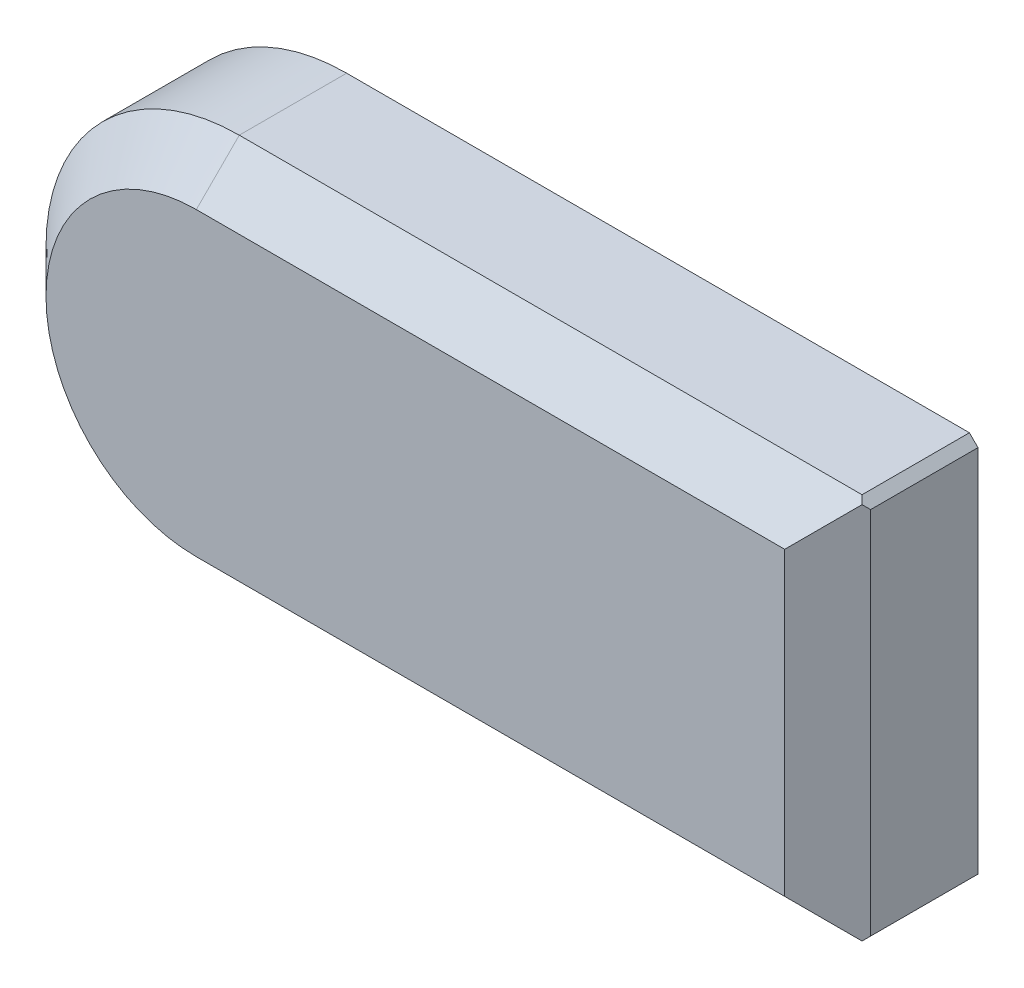
ISO-10303-21;
HEADER;
FILE_DESCRIPTION(('STEP AP214'),'2;1');
FILE_NAME('part.step','',(''),(''),'','','');
FILE_SCHEMA(('AUTOMOTIVE_DESIGN { 1 0 10303 214 1 1 1 1 }'));
ENDSEC;
DATA;
#1=APPLICATION_CONTEXT('core data for automotive mechanical design processes');
#2=APPLICATION_PROTOCOL_DEFINITION('international standard','automotive_design',2000,#1);
#3=PRODUCT_CONTEXT('',#1,'mechanical');
#4=PRODUCT('Part','Part','',(#3));
#5=PRODUCT_RELATED_PRODUCT_CATEGORY('part','',(#4));
#6=PRODUCT_DEFINITION_FORMATION('','',#4);
#7=PRODUCT_DEFINITION_CONTEXT('part definition',#1,'design');
#8=PRODUCT_DEFINITION('design','',#6,#7);
#9=PRODUCT_DEFINITION_SHAPE('','',#8);
#10=(LENGTH_UNIT() NAMED_UNIT(*) SI_UNIT(.MILLI.,.METRE.));
#11=(NAMED_UNIT(*) PLANE_ANGLE_UNIT() SI_UNIT($,.RADIAN.));
#12=(NAMED_UNIT(*) SI_UNIT($,.STERADIAN.) SOLID_ANGLE_UNIT());
#13=UNCERTAINTY_MEASURE_WITH_UNIT(LENGTH_MEASURE(1.E-05),#10,'distance_accuracy_value','');
#14=(GEOMETRIC_REPRESENTATION_CONTEXT(3) GLOBAL_UNCERTAINTY_ASSIGNED_CONTEXT((#13)) GLOBAL_UNIT_ASSIGNED_CONTEXT((#10,
#11,#12)) REPRESENTATION_CONTEXT('',''));
#15=CARTESIAN_POINT('',(0.,0.,0.));
#16=DIRECTION('',(0.,0.,1.));
#17=DIRECTION('',(1.,0.,0.));
#18=AXIS2_PLACEMENT_3D('',#15,#16,#17);
#19=CARTESIAN_POINT('',(-36.75,0.,17.5));
#20=DIRECTION('',(0.,0.,-1.));
#21=DIRECTION('',(-1.,0.,0.));
#22=AXIS2_PLACEMENT_3D('',#19,#20,#21);
#23=CYLINDRICAL_SURFACE('',#22,22.5);
#24=DIRECTION('',(0.,0.,-1.));
#25=VECTOR('',#24,1.);
#26=CARTESIAN_POINT('',(-36.75,-22.5,17.5));
#27=LINE('',#26,#25);
#28=CARTESIAN_POINT('',(-36.75,-22.5,12.5));
#29=VERTEX_POINT('',#28);
#30=CARTESIAN_POINT('',(-36.75,-22.5,0.));
#31=VERTEX_POINT('',#30);
#32=EDGE_CURVE('E371',#29,#31,#27,.T.);
#33=ORIENTED_EDGE('',*,*,#32,.F.);
#34=CARTESIAN_POINT('',(-36.75,0.,12.5));
#35=DIRECTION('',(0.,0.,1.));
#36=DIRECTION('',(1.,0.,0.));
#37=AXIS2_PLACEMENT_3D('',#34,#35,#36);
#38=CIRCLE('',#37,22.5);
#39=CARTESIAN_POINT('',(-36.75,22.5,12.5));
#40=VERTEX_POINT('',#39);
#41=EDGE_CURVE('E385',#29,#40,#38,.F.);
#42=ORIENTED_EDGE('',*,*,#41,.T.);
#43=DIRECTION('',(0.,0.,-1.));
#44=VECTOR('',#43,1.);
#45=CARTESIAN_POINT('',(-36.75,22.5,17.5));
#46=LINE('',#45,#44);
#47=CARTESIAN_POINT('',(-36.75,22.5,0.));
#48=VERTEX_POINT('',#47);
#49=EDGE_CURVE('E369',#40,#48,#46,.T.);
#50=ORIENTED_EDGE('',*,*,#49,.T.);
#51=CARTESIAN_POINT('',(-36.75,0.,0.));
#52=DIRECTION('',(0.,0.,1.));
#53=DIRECTION('',(1.,0.,0.));
#54=AXIS2_PLACEMENT_3D('',#51,#52,#53);
#55=CIRCLE('',#54,22.5);
#56=EDGE_CURVE('E357',#48,#31,#55,.T.);
#57=ORIENTED_EDGE('',*,*,#56,.T.);
#58=EDGE_LOOP('',(#33,#42,#50,#57));
#59=FACE_BOUND('',#58,.T.);
#60=ADVANCED_FACE('F41',(#59),#23,.T.);
#61=CARTESIAN_POINT('',(0.,-22.5,17.5));
#62=DIRECTION('',(0.,1.,0.));
#63=DIRECTION('',(0.,0.,1.));
#64=AXIS2_PLACEMENT_3D('',#61,#62,#63);
#65=PLANE('',#64);
#66=DIRECTION('',(1.,0.,0.));
#67=VECTOR('',#66,1.);
#68=CARTESIAN_POINT('',(0.,-22.5,0.));
#69=LINE('',#68,#67);
#70=CARTESIAN_POINT('',(35.75,-22.5,0.));
#71=VERTEX_POINT('',#70);
#72=EDGE_CURVE('E360',#31,#71,#69,.T.);
#73=ORIENTED_EDGE('',*,*,#72,.T.);
#74=DIRECTION('',(0.,0.,1.));
#75=VECTOR('',#74,1.);
#76=CARTESIAN_POINT('',(35.75,-22.5,12.5));
#77=LINE('',#76,#75);
#78=CARTESIAN_POINT('',(35.75,-22.5,12.5));
#79=VERTEX_POINT('',#78);
#80=EDGE_CURVE('E50',#71,#79,#77,.T.);
#81=ORIENTED_EDGE('',*,*,#80,.T.);
#82=DIRECTION('',(-1.,0.,0.));
#83=VECTOR('',#82,1.);
#84=CARTESIAN_POINT('',(-36.75,-22.5,12.5));
#85=LINE('',#84,#83);
#86=EDGE_CURVE('E383',#79,#29,#85,.T.);
#87=ORIENTED_EDGE('',*,*,#86,.T.);
#88=ORIENTED_EDGE('',*,*,#32,.T.);
#89=EDGE_LOOP('',(#73,#81,#87,#88));
#90=FACE_BOUND('',#89,.T.);
#91=ADVANCED_FACE('F448',(#90),#65,.F.);
#92=CARTESIAN_POINT('',(36.75,0.,17.5));
#93=DIRECTION('',(1.,0.,0.));
#94=DIRECTION('',(0.,1.,0.));
#95=AXIS2_PLACEMENT_3D('',#92,#93,#94);
#96=PLANE('',#95);
#97=DIRECTION('',(0.,-1.,0.));
#98=VECTOR('',#97,1.);
#99=CARTESIAN_POINT('',(36.75,0.,0.));
#100=LINE('',#99,#98);
#101=CARTESIAN_POINT('',(36.75,21.5,0.));
#102=VERTEX_POINT('',#101);
#103=CARTESIAN_POINT('',(36.75,-21.5,0.));
#104=VERTEX_POINT('',#103);
#105=EDGE_CURVE('E363',#102,#104,#100,.T.);
#106=ORIENTED_EDGE('',*,*,#105,.F.);
#107=DIRECTION('',(0.,0.,1.));
#108=VECTOR('',#107,1.);
#109=CARTESIAN_POINT('',(36.75,21.5,17.5));
#110=LINE('',#109,#108);
#111=CARTESIAN_POINT('',(36.75,21.5,12.5));
#112=VERTEX_POINT('',#111);
#113=EDGE_CURVE('E414',#102,#112,#110,.T.);
#114=ORIENTED_EDGE('',*,*,#113,.T.);
#115=DIRECTION('',(0.,-1.,0.));
#116=VECTOR('',#115,1.);
#117=CARTESIAN_POINT('',(36.75,0.,12.5));
#118=LINE('',#117,#116);
#119=CARTESIAN_POINT('',(36.75,-21.5,12.5));
#120=VERTEX_POINT('',#119);
#121=EDGE_CURVE('E387',#112,#120,#118,.T.);
#122=ORIENTED_EDGE('',*,*,#121,.T.);
#123=DIRECTION('',(0.,0.,-1.));
#124=VECTOR('',#123,1.);
#125=CARTESIAN_POINT('',(36.75,-21.5,0.));
#126=LINE('',#125,#124);
#127=EDGE_CURVE('E411',#120,#104,#126,.T.);
#128=ORIENTED_EDGE('',*,*,#127,.T.);
#129=EDGE_LOOP('',(#106,#114,#122,#128));
#130=FACE_BOUND('',#129,.T.);
#131=ADVANCED_FACE('F442',(#130),#96,.T.);
#132=CARTESIAN_POINT('',(0.,22.5,17.5));
#133=DIRECTION('',(0.,1.,0.));
#134=DIRECTION('',(0.,0.,1.));
#135=AXIS2_PLACEMENT_3D('',#132,#133,#134);
#136=PLANE('',#135);
#137=DIRECTION('',(1.,0.,0.));
#138=VECTOR('',#137,1.);
#139=CARTESIAN_POINT('',(0.,22.5,12.5));
#140=LINE('',#139,#138);
#141=CARTESIAN_POINT('',(35.75,22.5,12.5));
#142=VERTEX_POINT('',#141);
#143=EDGE_CURVE('E390',#40,#142,#140,.T.);
#144=ORIENTED_EDGE('',*,*,#143,.T.);
#145=DIRECTION('',(0.,0.,-1.));
#146=VECTOR('',#145,1.);
#147=CARTESIAN_POINT('',(35.75,22.5,17.5));
#148=LINE('',#147,#146);
#149=CARTESIAN_POINT('',(35.75,22.5,0.));
#150=VERTEX_POINT('',#149);
#151=EDGE_CURVE('E404',#142,#150,#148,.T.);
#152=ORIENTED_EDGE('',*,*,#151,.T.);
#153=DIRECTION('',(1.,0.,0.));
#154=VECTOR('',#153,1.);
#155=CARTESIAN_POINT('',(0.,22.5,0.));
#156=LINE('',#155,#154);
#157=EDGE_CURVE('E366',#48,#150,#156,.T.);
#158=ORIENTED_EDGE('',*,*,#157,.F.);
#159=ORIENTED_EDGE('',*,*,#49,.F.);
#160=EDGE_LOOP('',(#144,#152,#158,#159));
#161=FACE_BOUND('',#160,.T.);
#162=ADVANCED_FACE('F433',(#161),#136,.T.);
#163=CARTESIAN_POINT('',(0.,0.,17.5));
#164=DIRECTION('',(0.,0.,1.));
#165=DIRECTION('',(1.,0.,0.));
#166=AXIS2_PLACEMENT_3D('',#163,#164,#165);
#167=PLANE('',#166);
#168=CARTESIAN_POINT('',(-36.75,0.,17.5));
#169=DIRECTION('',(0.,0.,1.));
#170=DIRECTION('',(1.,0.,0.));
#171=AXIS2_PLACEMENT_3D('',#168,#169,#170);
#172=CIRCLE('',#171,17.5);
#173=CARTESIAN_POINT('',(-36.75,17.5,17.5));
#174=VERTEX_POINT('',#173);
#175=CARTESIAN_POINT('',(-36.75,-17.5,17.5));
#176=VERTEX_POINT('',#175);
#177=EDGE_CURVE('E378',#174,#176,#172,.T.);
#178=ORIENTED_EDGE('',*,*,#177,.T.);
#179=DIRECTION('',(1.,0.,0.));
#180=VECTOR('',#179,1.);
#181=CARTESIAN_POINT('',(36.75,-17.5,17.5));
#182=LINE('',#181,#180);
#183=CARTESIAN_POINT('',(31.75,-17.5,17.5));
#184=VERTEX_POINT('',#183);
#185=EDGE_CURVE('E380',#176,#184,#182,.T.);
#186=ORIENTED_EDGE('',*,*,#185,.T.);
#187=DIRECTION('',(0.,1.,0.));
#188=VECTOR('',#187,1.);
#189=CARTESIAN_POINT('',(31.75,0.,17.5));
#190=LINE('',#189,#188);
#191=CARTESIAN_POINT('',(31.75,17.5,17.5));
#192=VERTEX_POINT('',#191);
#193=EDGE_CURVE('E375',#184,#192,#190,.T.);
#194=ORIENTED_EDGE('',*,*,#193,.T.);
#195=DIRECTION('',(-1.,0.,0.));
#196=VECTOR('',#195,1.);
#197=CARTESIAN_POINT('',(0.,17.5,17.5));
#198=LINE('',#197,#196);
#199=EDGE_CURVE('E373',#192,#174,#198,.T.);
#200=ORIENTED_EDGE('',*,*,#199,.T.);
#201=EDGE_LOOP('',(#178,#186,#194,#200));
#202=FACE_BOUND('',#201,.T.);
#203=ADVANCED_FACE('F458',(#202),#167,.T.);
#204=CARTESIAN_POINT('',(0.,0.,0.));
#205=DIRECTION('',(0.,0.,1.));
#206=DIRECTION('',(1.,0.,0.));
#207=AXIS2_PLACEMENT_3D('',#204,#205,#206);
#208=PLANE('',#207);
#209=DIRECTION('',(1.,0.,0.));
#210=VECTOR('',#209,1.);
#211=CARTESIAN_POINT('',(-36.75,21.2,0.));
#212=LINE('',#211,#210);
#213=CARTESIAN_POINT('',(-36.75,21.2,0.));
#214=VERTEX_POINT('',#213);
#215=CARTESIAN_POINT('',(35.45,21.2,0.));
#216=VERTEX_POINT('',#215);
#217=EDGE_CURVE('E300',#214,#216,#212,.T.);
#218=ORIENTED_EDGE('',*,*,#217,.F.);
#219=CARTESIAN_POINT('',(-36.75,0.,0.));
#220=DIRECTION('',(0.,0.,-1.));
#221=DIRECTION('',(-1.,0.,0.));
#222=AXIS2_PLACEMENT_3D('',#219,#220,#221);
#223=CIRCLE('',#222,21.2);
#224=CARTESIAN_POINT('',(-36.75,-21.2,0.));
#225=VERTEX_POINT('',#224);
#226=EDGE_CURVE('E284',#225,#214,#223,.T.);
#227=ORIENTED_EDGE('',*,*,#226,.F.);
#228=DIRECTION('',(-1.,0.,0.));
#229=VECTOR('',#228,1.);
#230=CARTESIAN_POINT('',(-36.75,-21.2,0.));
#231=LINE('',#230,#229);
#232=CARTESIAN_POINT('',(35.45,-21.2,0.));
#233=VERTEX_POINT('',#232);
#234=EDGE_CURVE('E289',#233,#225,#231,.T.);
#235=ORIENTED_EDGE('',*,*,#234,.F.);
#236=DIRECTION('',(0.,-1.,0.));
#237=VECTOR('',#236,1.);
#238=CARTESIAN_POINT('',(35.45,21.2,0.));
#239=LINE('',#238,#237);
#240=EDGE_CURVE('E303',#216,#233,#239,.T.);
#241=ORIENTED_EDGE('',*,*,#240,.F.);
#242=EDGE_LOOP('',(#218,#227,#235,#241));
#243=FACE_BOUND('',#242,.T.);
#244=ORIENTED_EDGE('',*,*,#157,.T.);
#245=DIRECTION('',(-0.70710678118654,0.707106781186555,0.));
#246=VECTOR('',#245,1.);
#247=CARTESIAN_POINT('',(35.75,22.5,0.));
#248=LINE('',#247,#246);
#249=EDGE_CURVE('E409',#150,#102,#248,.F.);
#250=ORIENTED_EDGE('',*,*,#249,.T.);
#251=ORIENTED_EDGE('',*,*,#105,.T.);
#252=DIRECTION('',(-0.707106781186548,-0.707106781186548,0.));
#253=VECTOR('',#252,1.);
#254=CARTESIAN_POINT('',(36.75,-21.5,0.));
#255=LINE('',#254,#253);
#256=EDGE_CURVE('E407',#104,#71,#255,.T.);
#257=ORIENTED_EDGE('',*,*,#256,.T.);
#258=ORIENTED_EDGE('',*,*,#72,.F.);
#259=ORIENTED_EDGE('',*,*,#56,.F.);
#260=EDGE_LOOP('',(#244,#250,#251,#257,#258,#259));
#261=FACE_BOUND('',#260,.T.);
#262=ADVANCED_FACE('F439',(#243,#261),#208,.F.);
#263=CARTESIAN_POINT('',(0.,22.5,12.5));
#264=DIRECTION('',(0.,-0.707106781186546,-0.707106781186548));
#265=DIRECTION('',(1.,0.,0.));
#266=AXIS2_PLACEMENT_3D('',#263,#264,#265);
#267=PLANE('',#266);
#268=DIRECTION('',(0.577350269189626,0.577350269189626,-0.577350269189625));
#269=VECTOR('',#268,1.);
#270=CARTESIAN_POINT('',(24.5,10.25,24.75));
#271=LINE('',#270,#269);
#272=CARTESIAN_POINT('',(36.25,22.,13.));
#273=VERTEX_POINT('',#272);
#274=EDGE_CURVE('E398',#273,#192,#271,.F.);
#275=ORIENTED_EDGE('',*,*,#274,.F.);
#276=DIRECTION('',(-0.577350269189618,0.57735026918963,-0.577350269189629));
#277=VECTOR('',#276,1.);
#278=CARTESIAN_POINT('',(23.8333333333336,34.4166666666666,0.583333333333434));
#279=LINE('',#278,#277);
#280=EDGE_CURVE('E420',#273,#142,#279,.T.);
#281=ORIENTED_EDGE('',*,*,#280,.T.);
#282=ORIENTED_EDGE('',*,*,#143,.F.);
#283=DIRECTION('',(0.,0.707106781186548,-0.707106781186546));
#284=VECTOR('',#283,1.);
#285=CARTESIAN_POINT('',(-36.75,17.5,17.5));
#286=LINE('',#285,#284);
#287=EDGE_CURVE('E361',#174,#40,#286,.T.);
#288=ORIENTED_EDGE('',*,*,#287,.F.);
#289=ORIENTED_EDGE('',*,*,#199,.F.);
#290=EDGE_LOOP('',(#275,#281,#282,#288,#289));
#291=FACE_BOUND('',#290,.T.);
#292=ADVANCED_FACE('F425',(#291),#267,.F.);
#293=CARTESIAN_POINT('',(-36.75,0.,17.5));
#294=DIRECTION('',(0.,0.,-1.));
#295=DIRECTION('',(-1.,0.,0.));
#296=AXIS2_PLACEMENT_3D('',#293,#294,#295);
#297=CONICAL_SURFACE('',#296,17.5,0.78539816339745);
#298=ORIENTED_EDGE('',*,*,#287,.T.);
#299=ORIENTED_EDGE('',*,*,#41,.F.);
#300=DIRECTION('',(0.,-0.707106781186548,-0.707106781186546));
#301=VECTOR('',#300,1.);
#302=CARTESIAN_POINT('',(-36.75,-17.5,17.5));
#303=LINE('',#302,#301);
#304=EDGE_CURVE('E395',#176,#29,#303,.T.);
#305=ORIENTED_EDGE('',*,*,#304,.F.);
#306=ORIENTED_EDGE('',*,*,#177,.F.);
#307=EDGE_LOOP('',(#298,#299,#305,#306));
#308=FACE_BOUND('',#307,.T.);
#309=ADVANCED_FACE('F454',(#308),#297,.T.);
#310=CARTESIAN_POINT('',(36.75,0.,12.5));
#311=DIRECTION('',(-0.707106781186546,0.,-0.707106781186548));
#312=DIRECTION('',(0.,-1.,0.));
#313=AXIS2_PLACEMENT_3D('',#310,#311,#312);
#314=PLANE('',#313);
#315=ORIENTED_EDGE('',*,*,#121,.F.);
#316=DIRECTION('',(-0.577350269189622,0.577350269189634,0.577350269189621));
#317=VECTOR('',#316,1.);
#318=CARTESIAN_POINT('',(43.9166666666667,14.3333333333331,5.33333333333331));
#319=LINE('',#318,#317);
#320=EDGE_CURVE('E418',#112,#273,#319,.T.);
#321=ORIENTED_EDGE('',*,*,#320,.T.);
#322=ORIENTED_EDGE('',*,*,#274,.T.);
#323=ORIENTED_EDGE('',*,*,#193,.F.);
#324=DIRECTION('',(-0.577350269189626,0.577350269189626,0.577350269189625));
#325=VECTOR('',#324,1.);
#326=CARTESIAN_POINT('',(29.25,-15.,20.));
#327=LINE('',#326,#325);
#328=CARTESIAN_POINT('',(36.25,-22.,13.));
#329=VERTEX_POINT('',#328);
#330=EDGE_CURVE('E341',#329,#184,#327,.T.);
#331=ORIENTED_EDGE('',*,*,#330,.F.);
#332=DIRECTION('',(-0.577350269189626,-0.577350269189626,0.577350269189625));
#333=VECTOR('',#332,1.);
#334=CARTESIAN_POINT('',(43.9166666666667,-14.3333333333333,5.33333333333336));
#335=LINE('',#334,#333);
#336=EDGE_CURVE('E416',#329,#120,#335,.F.);
#337=ORIENTED_EDGE('',*,*,#336,.T.);
#338=EDGE_LOOP('',(#315,#321,#322,#323,#331,#337));
#339=FACE_BOUND('',#338,.T.);
#340=ADVANCED_FACE('F461',(#339),#314,.F.);
#341=CARTESIAN_POINT('',(0.,-17.5,17.5));
#342=DIRECTION('',(0.,-0.707106781186546,0.707106781186548));
#343=DIRECTION('',(-1.,0.,0.));
#344=AXIS2_PLACEMENT_3D('',#341,#342,#343);
#345=PLANE('',#344);
#346=ORIENTED_EDGE('',*,*,#86,.F.);
#347=DIRECTION('',(0.577350269189626,0.577350269189626,0.577350269189625));
#348=VECTOR('',#347,1.);
#349=CARTESIAN_POINT('',(27.1666666666666,-31.0833333333333,3.91666666666668));
#350=LINE('',#349,#348);
#351=EDGE_CURVE('E12',#79,#329,#350,.T.);
#352=ORIENTED_EDGE('',*,*,#351,.T.);
#353=ORIENTED_EDGE('',*,*,#330,.T.);
#354=ORIENTED_EDGE('',*,*,#185,.F.);
#355=ORIENTED_EDGE('',*,*,#304,.T.);
#356=EDGE_LOOP('',(#346,#352,#353,#354,#355));
#357=FACE_BOUND('',#356,.T.);
#358=ADVANCED_FACE('F462',(#357),#345,.T.);
#359=CARTESIAN_POINT('',(-36.75,0.,1.2));
#360=DIRECTION('',(0.,0.,-1.));
#361=DIRECTION('',(-1.,0.,0.));
#362=AXIS2_PLACEMENT_3D('',#359,#360,#361);
#363=CYLINDRICAL_SURFACE('',#362,21.2);
#364=ORIENTED_EDGE('',*,*,#226,.T.);
#365=DIRECTION('',(0.,0.,-1.));
#366=VECTOR('',#365,1.);
#367=CARTESIAN_POINT('',(-36.75,21.2,1.2));
#368=LINE('',#367,#366);
#369=CARTESIAN_POINT('',(-36.75,21.2,1.2));
#370=VERTEX_POINT('',#369);
#371=EDGE_CURVE('E298',#370,#214,#368,.T.);
#372=ORIENTED_EDGE('',*,*,#371,.F.);
#373=CARTESIAN_POINT('',(-36.75,0.,1.2));
#374=DIRECTION('',(0.,0.,-1.));
#375=DIRECTION('',(-1.,0.,0.));
#376=AXIS2_PLACEMENT_3D('',#373,#374,#375);
#377=CIRCLE('',#376,21.2);
#378=CARTESIAN_POINT('',(-36.75,-21.2,1.2));
#379=VERTEX_POINT('',#378);
#380=EDGE_CURVE('E285',#379,#370,#377,.T.);
#381=ORIENTED_EDGE('',*,*,#380,.F.);
#382=DIRECTION('',(0.,0.,-1.));
#383=VECTOR('',#382,1.);
#384=CARTESIAN_POINT('',(-36.75,-21.2,1.2));
#385=LINE('',#384,#383);
#386=EDGE_CURVE('E308',#379,#225,#385,.T.);
#387=ORIENTED_EDGE('',*,*,#386,.T.);
#388=EDGE_LOOP('',(#364,#372,#381,#387));
#389=FACE_BOUND('',#388,.T.);
#390=ADVANCED_FACE('F464',(#389),#363,.F.);
#391=CARTESIAN_POINT('',(-36.75,-21.2,1.2));
#392=DIRECTION('',(0.,-1.,0.));
#393=DIRECTION('',(0.,0.,-1.));
#394=AXIS2_PLACEMENT_3D('',#391,#392,#393);
#395=PLANE('',#394);
#396=ORIENTED_EDGE('',*,*,#234,.T.);
#397=ORIENTED_EDGE('',*,*,#386,.F.);
#398=DIRECTION('',(-1.,0.,0.));
#399=VECTOR('',#398,1.);
#400=CARTESIAN_POINT('',(-36.75,-21.2,1.2));
#401=LINE('',#400,#399);
#402=CARTESIAN_POINT('',(35.45,-21.2,1.2));
#403=VERTEX_POINT('',#402);
#404=EDGE_CURVE('E295',#403,#379,#401,.T.);
#405=ORIENTED_EDGE('',*,*,#404,.F.);
#406=DIRECTION('',(0.,0.,-1.));
#407=VECTOR('',#406,1.);
#408=CARTESIAN_POINT('',(35.45,-21.2,1.2));
#409=LINE('',#408,#407);
#410=EDGE_CURVE('E311',#403,#233,#409,.T.);
#411=ORIENTED_EDGE('',*,*,#410,.T.);
#412=EDGE_LOOP('',(#396,#397,#405,#411));
#413=FACE_BOUND('',#412,.T.);
#414=ADVANCED_FACE('F470',(#413),#395,.F.);
#415=CARTESIAN_POINT('',(35.45,21.2,1.2));
#416=DIRECTION('',(1.,0.,0.));
#417=DIRECTION('',(0.,1.,0.));
#418=AXIS2_PLACEMENT_3D('',#415,#416,#417);
#419=PLANE('',#418);
#420=ORIENTED_EDGE('',*,*,#240,.T.);
#421=ORIENTED_EDGE('',*,*,#410,.F.);
#422=DIRECTION('',(0.,-1.,0.));
#423=VECTOR('',#422,1.);
#424=CARTESIAN_POINT('',(35.45,21.2,1.2));
#425=LINE('',#424,#423);
#426=CARTESIAN_POINT('',(35.45,21.2,1.2));
#427=VERTEX_POINT('',#426);
#428=EDGE_CURVE('E292',#427,#403,#425,.T.);
#429=ORIENTED_EDGE('',*,*,#428,.F.);
#430=DIRECTION('',(0.,0.,-1.));
#431=VECTOR('',#430,1.);
#432=CARTESIAN_POINT('',(35.45,21.2,1.2));
#433=LINE('',#432,#431);
#434=EDGE_CURVE('E313',#427,#216,#433,.T.);
#435=ORIENTED_EDGE('',*,*,#434,.T.);
#436=EDGE_LOOP('',(#420,#421,#429,#435));
#437=FACE_BOUND('',#436,.T.);
#438=ADVANCED_FACE('F532',(#437),#419,.F.);
#439=CARTESIAN_POINT('',(-36.75,21.2,1.2));
#440=DIRECTION('',(0.,1.,0.));
#441=DIRECTION('',(0.,0.,1.));
#442=AXIS2_PLACEMENT_3D('',#439,#440,#441);
#443=PLANE('',#442);
#444=ORIENTED_EDGE('',*,*,#217,.T.);
#445=ORIENTED_EDGE('',*,*,#434,.F.);
#446=DIRECTION('',(1.,0.,0.));
#447=VECTOR('',#446,1.);
#448=CARTESIAN_POINT('',(-36.75,21.2,1.2));
#449=LINE('',#448,#447);
#450=EDGE_CURVE('E288',#370,#427,#449,.T.);
#451=ORIENTED_EDGE('',*,*,#450,.F.);
#452=ORIENTED_EDGE('',*,*,#371,.T.);
#453=EDGE_LOOP('',(#444,#445,#451,#452));
#454=FACE_BOUND('',#453,.T.);
#455=ADVANCED_FACE('F529',(#454),#443,.F.);
#456=CARTESIAN_POINT('',(-36.75,0.,1.2));
#457=DIRECTION('',(0.,0.,-1.));
#458=DIRECTION('',(-1.,0.,0.));
#459=AXIS2_PLACEMENT_3D('',#456,#457,#458);
#460=PLANE('',#459);
#461=DIRECTION('',(-1.,0.,0.));
#462=VECTOR('',#461,1.);
#463=CARTESIAN_POINT('',(-36.75,-20.,1.2));
#464=LINE('',#463,#462);
#465=CARTESIAN_POINT('',(34.25,-20.,1.2));
#466=VERTEX_POINT('',#465);
#467=CARTESIAN_POINT('',(-36.75,-20.,1.2));
#468=VERTEX_POINT('',#467);
#469=EDGE_CURVE('E281',#466,#468,#464,.T.);
#470=ORIENTED_EDGE('',*,*,#469,.F.);
#471=DIRECTION('',(0.,-1.,0.));
#472=VECTOR('',#471,1.);
#473=CARTESIAN_POINT('',(34.25,20.,1.2));
#474=LINE('',#473,#472);
#475=CARTESIAN_POINT('',(34.25,20.,1.2));
#476=VERTEX_POINT('',#475);
#477=EDGE_CURVE('E278',#476,#466,#474,.T.);
#478=ORIENTED_EDGE('',*,*,#477,.F.);
#479=DIRECTION('',(1.,0.,0.));
#480=VECTOR('',#479,1.);
#481=CARTESIAN_POINT('',(-36.75,20.,1.2));
#482=LINE('',#481,#480);
#483=CARTESIAN_POINT('',(-36.75,20.,1.2));
#484=VERTEX_POINT('',#483);
#485=EDGE_CURVE('E275',#484,#476,#482,.T.);
#486=ORIENTED_EDGE('',*,*,#485,.F.);
#487=CARTESIAN_POINT('',(-36.75,0.,1.2));
#488=DIRECTION('',(0.,0.,-1.));
#489=DIRECTION('',(-1.,0.,0.));
#490=AXIS2_PLACEMENT_3D('',#487,#488,#489);
#491=CIRCLE('',#490,20.);
#492=EDGE_CURVE('E272',#468,#484,#491,.T.);
#493=ORIENTED_EDGE('',*,*,#492,.F.);
#494=EDGE_LOOP('',(#470,#478,#486,#493));
#495=FACE_BOUND('',#494,.T.);
#496=ORIENTED_EDGE('',*,*,#380,.T.);
#497=ORIENTED_EDGE('',*,*,#450,.T.);
#498=ORIENTED_EDGE('',*,*,#428,.T.);
#499=ORIENTED_EDGE('',*,*,#404,.T.);
#500=EDGE_LOOP('',(#496,#497,#498,#499));
#501=FACE_BOUND('',#500,.T.);
#502=ADVANCED_FACE('F511',(#495,#501),#460,.T.);
#503=CARTESIAN_POINT('',(0.,0.,15.));
#504=DIRECTION('',(0.,0.,1.));
#505=DIRECTION('',(1.,0.,0.));
#506=AXIS2_PLACEMENT_3D('',#503,#504,#505);
#507=PLANE('',#506);
#508=CARTESIAN_POINT('',(-11.25,0.,15.));
#509=DIRECTION('',(0.,0.,1.));
#510=DIRECTION('',(1.,0.,0.));
#511=AXIS2_PLACEMENT_3D('',#508,#509,#510);
#512=CIRCLE('',#511,5.);
#513=CARTESIAN_POINT('',(-6.25,0.,15.));
#514=VERTEX_POINT('',#513);
#515=EDGE_CURVE('E393',#514,#514,#512,.F.);
#516=ORIENTED_EDGE('',*,*,#515,.F.);
#517=EDGE_LOOP('',(#516));
#518=FACE_BOUND('',#517,.T.);
#519=CARTESIAN_POINT('',(-36.75,0.,15.));
#520=DIRECTION('',(0.,0.,1.));
#521=DIRECTION('',(1.,0.,0.));
#522=AXIS2_PLACEMENT_3D('',#519,#520,#521);
#523=CIRCLE('',#522,16.4644660940673);
#524=CARTESIAN_POINT('',(-36.75,16.4644660940673,15.));
#525=VERTEX_POINT('',#524);
#526=CARTESIAN_POINT('',(-36.75,-16.4644660940673,15.));
#527=VERTEX_POINT('',#526);
#528=EDGE_CURVE('E350',#525,#527,#523,.T.);
#529=ORIENTED_EDGE('',*,*,#528,.F.);
#530=DIRECTION('',(1.,0.,0.));
#531=VECTOR('',#530,1.);
#532=CARTESIAN_POINT('',(0.,16.4644660940673,15.));
#533=LINE('',#532,#531);
#534=CARTESIAN_POINT('',(30.7144660940673,16.4644660940673,15.));
#535=VERTEX_POINT('',#534);
#536=EDGE_CURVE('E320',#535,#525,#533,.F.);
#537=ORIENTED_EDGE('',*,*,#536,.F.);
#538=DIRECTION('',(0.,-1.,0.));
#539=VECTOR('',#538,1.);
#540=CARTESIAN_POINT('',(30.7144660940673,0.,15.));
#541=LINE('',#540,#539);
#542=CARTESIAN_POINT('',(30.7144660940673,-16.4644660940673,15.));
#543=VERTEX_POINT('',#542);
#544=EDGE_CURVE('E349',#543,#535,#541,.F.);
#545=ORIENTED_EDGE('',*,*,#544,.F.);
#546=DIRECTION('',(1.,0.,0.));
#547=VECTOR('',#546,1.);
#548=CARTESIAN_POINT('',(0.,-16.4644660940673,15.));
#549=LINE('',#548,#547);
#550=EDGE_CURVE('E335',#527,#543,#549,.T.);
#551=ORIENTED_EDGE('',*,*,#550,.F.);
#552=EDGE_LOOP('',(#529,#537,#545,#551));
#553=FACE_BOUND('',#552,.T.);
#554=ADVANCED_FACE('F503',(#518,#553),#507,.F.);
#555=CARTESIAN_POINT('',(-36.75,0.,15.7322330470336));
#556=DIRECTION('',(0.,0.,-1.));
#557=DIRECTION('',(-1.,0.,0.));
#558=AXIS2_PLACEMENT_3D('',#555,#556,#557);
#559=CONICAL_SURFACE('',#558,15.7322330470336,0.78539816339745);
#560=DIRECTION('',(0.,0.707106781186548,-0.707106781186547));
#561=VECTOR('',#560,1.);
#562=CARTESIAN_POINT('',(-36.75,15.7322330470336,15.7322330470336));
#563=LINE('',#562,#561);
#564=CARTESIAN_POINT('',(-36.75,20.,11.4644660940673));
#565=VERTEX_POINT('',#564);
#566=EDGE_CURVE('E330',#525,#565,#563,.T.);
#567=ORIENTED_EDGE('',*,*,#566,.F.);
#568=ORIENTED_EDGE('',*,*,#528,.T.);
#569=DIRECTION('',(0.,-0.707106781186548,-0.707106781186546));
#570=VECTOR('',#569,1.);
#571=CARTESIAN_POINT('',(-36.75,-15.7322330470336,15.7322330470336));
#572=LINE('',#571,#570);
#573=CARTESIAN_POINT('',(-36.75,-20.,11.4644660940673));
#574=VERTEX_POINT('',#573);
#575=EDGE_CURVE('E345',#527,#574,#572,.T.);
#576=ORIENTED_EDGE('',*,*,#575,.T.);
#577=CARTESIAN_POINT('',(-36.75,0.,11.4644660940673));
#578=DIRECTION('',(0.,0.,-1.));
#579=DIRECTION('',(-1.,0.,0.));
#580=AXIS2_PLACEMENT_3D('',#577,#578,#579);
#581=CIRCLE('',#580,20.);
#582=EDGE_CURVE('E322',#574,#565,#581,.T.);
#583=ORIENTED_EDGE('',*,*,#582,.T.);
#584=EDGE_LOOP('',(#567,#568,#576,#583));
#585=FACE_BOUND('',#584,.T.);
#586=ADVANCED_FACE('F495',(#585),#559,.F.);
#587=CARTESIAN_POINT('',(0.,-15.7322330470336,15.7322330470336));
#588=DIRECTION('',(0.,-0.707106781186546,0.707106781186548));
#589=DIRECTION('',(-1.,0.,0.));
#590=AXIS2_PLACEMENT_3D('',#587,#588,#589);
#591=PLANE('',#590);
#592=ORIENTED_EDGE('',*,*,#575,.F.);
#593=ORIENTED_EDGE('',*,*,#550,.T.);
#594=DIRECTION('',(0.577350269189626,-0.577350269189626,-0.577350269189625));
#595=VECTOR('',#594,1.);
#596=CARTESIAN_POINT('',(19.9881553646891,-5.73815536468907,25.7263107293782));
#597=LINE('',#596,#595);
#598=CARTESIAN_POINT('',(34.25,-20.,11.4644660940673));
#599=VERTEX_POINT('',#598);
#600=EDGE_CURVE('E310',#599,#543,#597,.F.);
#601=ORIENTED_EDGE('',*,*,#600,.F.);
#602=DIRECTION('',(-1.,0.,0.));
#603=VECTOR('',#602,1.);
#604=CARTESIAN_POINT('',(0.,-20.,11.4644660940673));
#605=LINE('',#604,#603);
#606=EDGE_CURVE('E325',#599,#574,#605,.T.);
#607=ORIENTED_EDGE('',*,*,#606,.T.);
#608=EDGE_LOOP('',(#592,#593,#601,#607));
#609=FACE_BOUND('',#608,.T.);
#610=ADVANCED_FACE('F491',(#609),#591,.F.);
#611=CARTESIAN_POINT('',(34.9822330470336,0.,10.7322330470336));
#612=DIRECTION('',(-0.707106781186546,0.,-0.707106781186548));
#613=DIRECTION('',(0.,-1.,0.));
#614=AXIS2_PLACEMENT_3D('',#611,#612,#613);
#615=PLANE('',#614);
#616=DIRECTION('',(-0.577350269189626,-0.577350269189626,0.577350269189625));
#617=VECTOR('',#616,1.);
#618=CARTESIAN_POINT('',(28.0714886980224,13.8214886980224,17.6429773960448));
#619=LINE('',#618,#617);
#620=CARTESIAN_POINT('',(34.25,20.,11.4644660940673));
#621=VERTEX_POINT('',#620);
#622=EDGE_CURVE('E342',#621,#535,#619,.T.);
#623=ORIENTED_EDGE('',*,*,#622,.F.);
#624=DIRECTION('',(0.,1.,0.));
#625=VECTOR('',#624,1.);
#626=CARTESIAN_POINT('',(34.25,0.,11.4644660940673));
#627=LINE('',#626,#625);
#628=EDGE_CURVE('E324',#621,#599,#627,.F.);
#629=ORIENTED_EDGE('',*,*,#628,.T.);
#630=ORIENTED_EDGE('',*,*,#600,.T.);
#631=ORIENTED_EDGE('',*,*,#544,.T.);
#632=EDGE_LOOP('',(#623,#629,#630,#631));
#633=FACE_BOUND('',#632,.T.);
#634=ADVANCED_FACE('F494',(#633),#615,.T.);
#635=CARTESIAN_POINT('',(0.,20.7322330470336,10.7322330470336));
#636=DIRECTION('',(0.,-0.707106781186546,-0.707106781186548));
#637=DIRECTION('',(1.,0.,0.));
#638=AXIS2_PLACEMENT_3D('',#635,#636,#637);
#639=PLANE('',#638);
#640=ORIENTED_EDGE('',*,*,#622,.T.);
#641=ORIENTED_EDGE('',*,*,#536,.T.);
#642=ORIENTED_EDGE('',*,*,#566,.T.);
#643=DIRECTION('',(-1.,0.,0.));
#644=VECTOR('',#643,1.);
#645=CARTESIAN_POINT('',(0.,20.,11.4644660940673));
#646=LINE('',#645,#644);
#647=EDGE_CURVE('E339',#565,#621,#646,.F.);
#648=ORIENTED_EDGE('',*,*,#647,.T.);
#649=EDGE_LOOP('',(#640,#641,#642,#648));
#650=FACE_BOUND('',#649,.T.);
#651=ADVANCED_FACE('F499',(#650),#639,.T.);
#652=CARTESIAN_POINT('',(0.,20.,17.5));
#653=DIRECTION('',(0.,1.,0.));
#654=DIRECTION('',(0.,0.,1.));
#655=AXIS2_PLACEMENT_3D('',#652,#653,#654);
#656=PLANE('',#655);
#657=ORIENTED_EDGE('',*,*,#485,.T.);
#658=DIRECTION('',(0.,0.,-1.));
#659=VECTOR('',#658,1.);
#660=CARTESIAN_POINT('',(34.25,20.,17.5));
#661=LINE('',#660,#659);
#662=EDGE_CURVE('E329',#621,#476,#661,.T.);
#663=ORIENTED_EDGE('',*,*,#662,.F.);
#664=ORIENTED_EDGE('',*,*,#647,.F.);
#665=DIRECTION('',(0.,0.,-1.));
#666=VECTOR('',#665,1.);
#667=CARTESIAN_POINT('',(-36.75,20.,17.5));
#668=LINE('',#667,#666);
#669=EDGE_CURVE('E326',#565,#484,#668,.T.);
#670=ORIENTED_EDGE('',*,*,#669,.T.);
#671=EDGE_LOOP('',(#657,#663,#664,#670));
#672=FACE_BOUND('',#671,.T.);
#673=ADVANCED_FACE('F507',(#672),#656,.F.);
#674=CARTESIAN_POINT('',(34.25,0.,17.5));
#675=DIRECTION('',(1.,0.,0.));
#676=DIRECTION('',(0.,1.,0.));
#677=AXIS2_PLACEMENT_3D('',#674,#675,#676);
#678=PLANE('',#677);
#679=ORIENTED_EDGE('',*,*,#477,.T.);
#680=DIRECTION('',(0.,0.,-1.));
#681=VECTOR('',#680,1.);
#682=CARTESIAN_POINT('',(34.25,-20.,17.5));
#683=LINE('',#682,#681);
#684=EDGE_CURVE('E321',#599,#466,#683,.T.);
#685=ORIENTED_EDGE('',*,*,#684,.F.);
#686=ORIENTED_EDGE('',*,*,#628,.F.);
#687=ORIENTED_EDGE('',*,*,#662,.T.);
#688=EDGE_LOOP('',(#679,#685,#686,#687));
#689=FACE_BOUND('',#688,.T.);
#690=ADVANCED_FACE('F515',(#689),#678,.F.);
#691=CARTESIAN_POINT('',(0.,-20.,17.5));
#692=DIRECTION('',(0.,1.,0.));
#693=DIRECTION('',(0.,0.,1.));
#694=AXIS2_PLACEMENT_3D('',#691,#692,#693);
#695=PLANE('',#694);
#696=ORIENTED_EDGE('',*,*,#684,.T.);
#697=ORIENTED_EDGE('',*,*,#469,.T.);
#698=DIRECTION('',(0.,0.,1.));
#699=VECTOR('',#698,1.);
#700=CARTESIAN_POINT('',(-36.75,-20.,17.5));
#701=LINE('',#700,#699);
#702=EDGE_CURVE('E317',#574,#468,#701,.F.);
#703=ORIENTED_EDGE('',*,*,#702,.F.);
#704=ORIENTED_EDGE('',*,*,#606,.F.);
#705=EDGE_LOOP('',(#696,#697,#703,#704));
#706=FACE_BOUND('',#705,.T.);
#707=ADVANCED_FACE('F519',(#706),#695,.T.);
#708=CARTESIAN_POINT('',(-36.75,0.,17.5));
#709=DIRECTION('',(0.,0.,-1.));
#710=DIRECTION('',(-1.,0.,0.));
#711=AXIS2_PLACEMENT_3D('',#708,#709,#710);
#712=CYLINDRICAL_SURFACE('',#711,20.);
#713=ORIENTED_EDGE('',*,*,#702,.T.);
#714=ORIENTED_EDGE('',*,*,#492,.T.);
#715=ORIENTED_EDGE('',*,*,#669,.F.);
#716=ORIENTED_EDGE('',*,*,#582,.F.);
#717=EDGE_LOOP('',(#713,#714,#715,#716));
#718=FACE_BOUND('',#717,.T.);
#719=ADVANCED_FACE('F523',(#718),#712,.F.);
#720=CARTESIAN_POINT('',(-11.25,0.,-14.142135623731));
#721=DIRECTION('',(0.,0.,1.));
#722=DIRECTION('',(1.,0.,0.));
#723=AXIS2_PLACEMENT_3D('',#720,#721,#722);
#724=CYLINDRICAL_SURFACE('',#723,5.);
#725=CARTESIAN_POINT('',(-11.25,0.,0.999999999999999));
#726=DIRECTION('',(0.,0.,1.));
#727=DIRECTION('',(1.,0.,0.));
#728=AXIS2_PLACEMENT_3D('',#725,#726,#727);
#729=CIRCLE('',#728,5.);
#730=CARTESIAN_POINT('',(-6.25,0.,0.999999999999999));
#731=VERTEX_POINT('',#730);
#732=EDGE_CURVE('E262',#731,#731,#729,.T.);
#733=ORIENTED_EDGE('',*,*,#732,.T.);
#734=EDGE_LOOP('',(#733));
#735=FACE_BOUND('',#734,.T.);
#736=ORIENTED_EDGE('',*,*,#515,.T.);
#737=EDGE_LOOP('',(#736));
#738=FACE_BOUND('',#737,.T.);
#739=ADVANCED_FACE('F526',(#735,#738),#724,.T.);
#740=CARTESIAN_POINT('',(0.,0.,1.));
#741=DIRECTION('',(0.,0.,1.));
#742=DIRECTION('',(1.,0.,0.));
#743=AXIS2_PLACEMENT_3D('',#740,#741,#742);
#744=PLANE('',#743);
#745=DIRECTION('',(-1.,0.,0.));
#746=VECTOR('',#745,1.);
#747=CARTESIAN_POINT('',(-9.66228675972853,-2.75,1.));
#748=LINE('',#747,#746);
#749=CARTESIAN_POINT('',(-9.66228675972853,-2.75,1.));
#750=VERTEX_POINT('',#749);
#751=CARTESIAN_POINT('',(-12.8377132402715,-2.75,1.));
#752=VERTEX_POINT('',#751);
#753=EDGE_CURVE('E249',#750,#752,#748,.T.);
#754=ORIENTED_EDGE('',*,*,#753,.F.);
#755=DIRECTION('',(-0.499999999999999,-0.866025403784439,0.));
#756=VECTOR('',#755,1.);
#757=CARTESIAN_POINT('',(-8.07457351945706,0.,1.));
#758=LINE('',#757,#756);
#759=CARTESIAN_POINT('',(-8.07457351945706,0.,1.));
#760=VERTEX_POINT('',#759);
#761=EDGE_CURVE('E214',#760,#750,#758,.T.);
#762=ORIENTED_EDGE('',*,*,#761,.F.);
#763=DIRECTION('',(0.5,-0.866025403784439,0.));
#764=VECTOR('',#763,1.);
#765=CARTESIAN_POINT('',(-9.66228675972853,2.75,1.));
#766=LINE('',#765,#764);
#767=CARTESIAN_POINT('',(-9.66228675972853,2.75,1.));
#768=VERTEX_POINT('',#767);
#769=EDGE_CURVE('E232',#768,#760,#766,.T.);
#770=ORIENTED_EDGE('',*,*,#769,.F.);
#771=DIRECTION('',(1.,0.,0.));
#772=VECTOR('',#771,1.);
#773=CARTESIAN_POINT('',(-12.8377132402715,2.75,1.));
#774=LINE('',#773,#772);
#775=CARTESIAN_POINT('',(-12.8377132402715,2.75,1.));
#776=VERTEX_POINT('',#775);
#777=EDGE_CURVE('E235',#776,#768,#774,.T.);
#778=ORIENTED_EDGE('',*,*,#777,.F.);
#779=DIRECTION('',(0.5,0.866025403784439,0.));
#780=VECTOR('',#779,1.);
#781=CARTESIAN_POINT('',(-14.4254264805429,0.,1.));
#782=LINE('',#781,#780);
#783=CARTESIAN_POINT('',(-14.4254264805429,0.,1.));
#784=VERTEX_POINT('',#783);
#785=EDGE_CURVE('E255',#784,#776,#782,.T.);
#786=ORIENTED_EDGE('',*,*,#785,.F.);
#787=DIRECTION('',(-0.5,0.866025403784439,0.));
#788=VECTOR('',#787,1.);
#789=CARTESIAN_POINT('',(-12.8377132402715,-2.75,1.));
#790=LINE('',#789,#788);
#791=EDGE_CURVE('E252',#752,#784,#790,.T.);
#792=ORIENTED_EDGE('',*,*,#791,.F.);
#793=EDGE_LOOP('',(#754,#762,#770,#778,#786,#792));
#794=FACE_BOUND('',#793,.T.);
#795=ORIENTED_EDGE('',*,*,#732,.F.);
#796=EDGE_LOOP('',(#795));
#797=FACE_BOUND('',#796,.T.);
#798=ADVANCED_FACE('F545',(#794,#797),#744,.F.);
#799=CARTESIAN_POINT('',(-8.07457351945706,0.,3.4));
#800=DIRECTION('',(0.866025403784439,-0.499999999999999,0.));
#801=DIRECTION('',(0.5,0.866025403784439,0.));
#802=AXIS2_PLACEMENT_3D('',#799,#800,#801);
#803=PLANE('',#802);
#804=ORIENTED_EDGE('',*,*,#761,.T.);
#805=DIRECTION('',(0.,0.,-1.));
#806=VECTOR('',#805,1.);
#807=CARTESIAN_POINT('',(-9.66228675972853,-2.75,3.4));
#808=LINE('',#807,#806);
#809=CARTESIAN_POINT('',(-9.66228675972853,-2.75,3.4));
#810=VERTEX_POINT('',#809);
#811=EDGE_CURVE('E207',#810,#750,#808,.T.);
#812=ORIENTED_EDGE('',*,*,#811,.F.);
#813=DIRECTION('',(-0.499999999999999,-0.866025403784439,0.));
#814=VECTOR('',#813,1.);
#815=CARTESIAN_POINT('',(-8.07457351945706,0.,3.4));
#816=LINE('',#815,#814);
#817=CARTESIAN_POINT('',(-8.07457351945706,0.,3.4));
#818=VERTEX_POINT('',#817);
#819=EDGE_CURVE('E211',#818,#810,#816,.T.);
#820=ORIENTED_EDGE('',*,*,#819,.F.);
#821=DIRECTION('',(0.,0.,-1.));
#822=VECTOR('',#821,1.);
#823=CARTESIAN_POINT('',(-8.07457351945706,0.,3.4));
#824=LINE('',#823,#822);
#825=EDGE_CURVE('E260',#818,#760,#824,.T.);
#826=ORIENTED_EDGE('',*,*,#825,.T.);
#827=EDGE_LOOP('',(#804,#812,#820,#826));
#828=FACE_BOUND('',#827,.T.);
#829=ADVANCED_FACE('F209',(#828),#803,.F.);
#830=CARTESIAN_POINT('',(-9.66228675972853,2.75,3.4));
#831=DIRECTION('',(0.866025403784439,0.5,0.));
#832=DIRECTION('',(-0.5,0.866025403784439,0.));
#833=AXIS2_PLACEMENT_3D('',#830,#831,#832);
#834=PLANE('',#833);
#835=ORIENTED_EDGE('',*,*,#769,.T.);
#836=ORIENTED_EDGE('',*,*,#825,.F.);
#837=DIRECTION('',(0.5,-0.866025403784439,0.));
#838=VECTOR('',#837,1.);
#839=CARTESIAN_POINT('',(-9.66228675972853,2.75,3.4));
#840=LINE('',#839,#838);
#841=CARTESIAN_POINT('',(-9.66228675972853,2.75,3.4));
#842=VERTEX_POINT('',#841);
#843=EDGE_CURVE('E219',#842,#818,#840,.T.);
#844=ORIENTED_EDGE('',*,*,#843,.F.);
#845=DIRECTION('',(0.,0.,-1.));
#846=VECTOR('',#845,1.);
#847=CARTESIAN_POINT('',(-9.66228675972853,2.75,3.4));
#848=LINE('',#847,#846);
#849=EDGE_CURVE('E263',#842,#768,#848,.T.);
#850=ORIENTED_EDGE('',*,*,#849,.T.);
#851=EDGE_LOOP('',(#835,#836,#844,#850));
#852=FACE_BOUND('',#851,.T.);
#853=ADVANCED_FACE('F552',(#852),#834,.F.);
#854=CARTESIAN_POINT('',(-12.8377132402715,2.75,3.4));
#855=DIRECTION('',(0.,1.,0.));
#856=DIRECTION('',(0.,0.,1.));
#857=AXIS2_PLACEMENT_3D('',#854,#855,#856);
#858=PLANE('',#857);
#859=ORIENTED_EDGE('',*,*,#777,.T.);
#860=ORIENTED_EDGE('',*,*,#849,.F.);
#861=DIRECTION('',(1.,0.,0.));
#862=VECTOR('',#861,1.);
#863=CARTESIAN_POINT('',(-12.8377132402715,2.75,3.4));
#864=LINE('',#863,#862);
#865=CARTESIAN_POINT('',(-12.8377132402715,2.75,3.4));
#866=VERTEX_POINT('',#865);
#867=EDGE_CURVE('E245',#866,#842,#864,.T.);
#868=ORIENTED_EDGE('',*,*,#867,.F.);
#869=DIRECTION('',(0.,0.,-1.));
#870=VECTOR('',#869,1.);
#871=CARTESIAN_POINT('',(-12.8377132402715,2.75,3.4));
#872=LINE('',#871,#870);
#873=EDGE_CURVE('E265',#866,#776,#872,.T.);
#874=ORIENTED_EDGE('',*,*,#873,.T.);
#875=EDGE_LOOP('',(#859,#860,#868,#874));
#876=FACE_BOUND('',#875,.T.);
#877=ADVANCED_FACE('F562',(#876),#858,.F.);
#878=CARTESIAN_POINT('',(-14.4254264805429,0.,3.4));
#879=DIRECTION('',(-0.866025403784439,0.5,0.));
#880=DIRECTION('',(-0.5,-0.866025403784439,0.));
#881=AXIS2_PLACEMENT_3D('',#878,#879,#880);
#882=PLANE('',#881);
#883=ORIENTED_EDGE('',*,*,#785,.T.);
#884=ORIENTED_EDGE('',*,*,#873,.F.);
#885=DIRECTION('',(0.5,0.866025403784439,0.));
#886=VECTOR('',#885,1.);
#887=CARTESIAN_POINT('',(-14.4254264805429,0.,3.4));
#888=LINE('',#887,#886);
#889=CARTESIAN_POINT('',(-14.4254264805429,0.,3.4));
#890=VERTEX_POINT('',#889);
#891=EDGE_CURVE('E242',#890,#866,#888,.T.);
#892=ORIENTED_EDGE('',*,*,#891,.F.);
#893=DIRECTION('',(0.,0.,-1.));
#894=VECTOR('',#893,1.);
#895=CARTESIAN_POINT('',(-14.4254264805429,0.,3.4));
#896=LINE('',#895,#894);
#897=EDGE_CURVE('E267',#890,#784,#896,.T.);
#898=ORIENTED_EDGE('',*,*,#897,.T.);
#899=EDGE_LOOP('',(#883,#884,#892,#898));
#900=FACE_BOUND('',#899,.T.);
#901=ADVANCED_FACE('F558',(#900),#882,.F.);
#902=CARTESIAN_POINT('',(-12.8377132402715,-2.75,3.4));
#903=DIRECTION('',(-0.866025403784439,-0.5,0.));
#904=DIRECTION('',(0.5,-0.866025403784439,0.));
#905=AXIS2_PLACEMENT_3D('',#902,#903,#904);
#906=PLANE('',#905);
#907=ORIENTED_EDGE('',*,*,#791,.T.);
#908=ORIENTED_EDGE('',*,*,#897,.F.);
#909=DIRECTION('',(-0.5,0.866025403784439,0.));
#910=VECTOR('',#909,1.);
#911=CARTESIAN_POINT('',(-12.8377132402715,-2.75,3.4));
#912=LINE('',#911,#910);
#913=CARTESIAN_POINT('',(-12.8377132402715,-2.75,3.4));
#914=VERTEX_POINT('',#913);
#915=EDGE_CURVE('E227',#914,#890,#912,.T.);
#916=ORIENTED_EDGE('',*,*,#915,.F.);
#917=DIRECTION('',(0.,0.,-1.));
#918=VECTOR('',#917,1.);
#919=CARTESIAN_POINT('',(-12.8377132402715,-2.75,3.4));
#920=LINE('',#919,#918);
#921=EDGE_CURVE('E218',#914,#752,#920,.T.);
#922=ORIENTED_EDGE('',*,*,#921,.T.);
#923=EDGE_LOOP('',(#907,#908,#916,#922));
#924=FACE_BOUND('',#923,.T.);
#925=ADVANCED_FACE('F555',(#924),#906,.F.);
#926=CARTESIAN_POINT('',(-9.66228675972853,-2.75,3.4));
#927=DIRECTION('',(0.,-1.,0.));
#928=DIRECTION('',(0.,0.,-1.));
#929=AXIS2_PLACEMENT_3D('',#926,#927,#928);
#930=PLANE('',#929);
#931=ORIENTED_EDGE('',*,*,#753,.T.);
#932=ORIENTED_EDGE('',*,*,#921,.F.);
#933=DIRECTION('',(-1.,0.,0.));
#934=VECTOR('',#933,1.);
#935=CARTESIAN_POINT('',(-9.66228675972853,-2.75,3.4));
#936=LINE('',#935,#934);
#937=EDGE_CURVE('E222',#810,#914,#936,.T.);
#938=ORIENTED_EDGE('',*,*,#937,.F.);
#939=ORIENTED_EDGE('',*,*,#811,.T.);
#940=EDGE_LOOP('',(#931,#932,#938,#939));
#941=FACE_BOUND('',#940,.T.);
#942=ADVANCED_FACE('F223',(#941),#930,.F.);
#943=CARTESIAN_POINT('',(0.,0.,3.4));
#944=DIRECTION('',(0.,0.,-1.));
#945=DIRECTION('',(-1.,0.,0.));
#946=AXIS2_PLACEMENT_3D('',#943,#944,#945);
#947=PLANE('',#946);
#948=CARTESIAN_POINT('',(-11.25,0.,3.4));
#949=DIRECTION('',(0.,0.,-1.));
#950=DIRECTION('',(-1.,0.,0.));
#951=AXIS2_PLACEMENT_3D('',#948,#949,#950);
#952=CIRCLE('',#951,1.6);
#953=CARTESIAN_POINT('',(-12.85,0.,3.4));
#954=VERTEX_POINT('',#953);
#955=EDGE_CURVE('E238',#954,#954,#952,.T.);
#956=ORIENTED_EDGE('',*,*,#955,.F.);
#957=EDGE_LOOP('',(#956));
#958=FACE_BOUND('',#957,.T.);
#959=ORIENTED_EDGE('',*,*,#819,.T.);
#960=ORIENTED_EDGE('',*,*,#937,.T.);
#961=ORIENTED_EDGE('',*,*,#915,.T.);
#962=ORIENTED_EDGE('',*,*,#891,.T.);
#963=ORIENTED_EDGE('',*,*,#867,.T.);
#964=ORIENTED_EDGE('',*,*,#843,.T.);
#965=EDGE_LOOP('',(#959,#960,#961,#962,#963,#964));
#966=FACE_BOUND('',#965,.T.);
#967=ADVANCED_FACE('F229',(#958,#966),#947,.T.);
#968=CARTESIAN_POINT('',(-11.25,0.,9.4));
#969=DIRECTION('',(0.,0.,-1.));
#970=DIRECTION('',(-1.,0.,0.));
#971=AXIS2_PLACEMENT_3D('',#968,#969,#970);
#972=CYLINDRICAL_SURFACE('',#971,1.6);
#973=CARTESIAN_POINT('',(-11.25,0.,9.4));
#974=DIRECTION('',(0.,0.,-1.));
#975=DIRECTION('',(-1.,0.,0.));
#976=AXIS2_PLACEMENT_3D('',#973,#974,#975);
#977=CIRCLE('',#976,1.6);
#978=CARTESIAN_POINT('',(-12.85,0.,9.4));
#979=VERTEX_POINT('',#978);
#980=EDGE_CURVE('E250',#979,#979,#977,.T.);
#981=ORIENTED_EDGE('',*,*,#980,.F.);
#982=EDGE_LOOP('',(#981));
#983=FACE_BOUND('',#982,.T.);
#984=ORIENTED_EDGE('',*,*,#955,.T.);
#985=EDGE_LOOP('',(#984));
#986=FACE_BOUND('',#985,.T.);
#987=ADVANCED_FACE('F572',(#983,#986),#972,.F.);
#988=CARTESIAN_POINT('',(-11.25,0.,9.4));
#989=DIRECTION('',(0.,0.,-1.));
#990=DIRECTION('',(-1.,0.,0.));
#991=AXIS2_PLACEMENT_3D('',#988,#989,#990);
#992=PLANE('',#991);
#993=ORIENTED_EDGE('',*,*,#980,.T.);
#994=EDGE_LOOP('',(#993));
#995=FACE_BOUND('',#994,.T.);
#996=ADVANCED_FACE('F576',(#995),#992,.T.);
#997=CARTESIAN_POINT('',(35.75,22.5,17.5));
#998=DIRECTION('',(-0.707106781186555,-0.70710678118654,0.));
#999=DIRECTION('',(0.,0.,-1.));
#1000=AXIS2_PLACEMENT_3D('',#997,#998,#999);
#1001=PLANE('',#1000);
#1002=ORIENTED_EDGE('',*,*,#320,.F.);
#1003=ORIENTED_EDGE('',*,*,#113,.F.);
#1004=ORIENTED_EDGE('',*,*,#249,.F.);
#1005=ORIENTED_EDGE('',*,*,#151,.F.);
#1006=ORIENTED_EDGE('',*,*,#280,.F.);
#1007=EDGE_LOOP('',(#1002,#1003,#1004,#1005,#1006));
#1008=FACE_BOUND('',#1007,.T.);
#1009=ADVANCED_FACE('F435',(#1008),#1001,.F.);
#1010=CARTESIAN_POINT('',(36.75,-21.5,17.5));
#1011=DIRECTION('',(0.707106781186547,-0.707106781186547,0.));
#1012=DIRECTION('',(0.,0.,1.));
#1013=AXIS2_PLACEMENT_3D('',#1010,#1011,#1012);
#1014=PLANE('',#1013);
#1015=ORIENTED_EDGE('',*,*,#351,.F.);
#1016=ORIENTED_EDGE('',*,*,#80,.F.);
#1017=ORIENTED_EDGE('',*,*,#256,.F.);
#1018=ORIENTED_EDGE('',*,*,#127,.F.);
#1019=ORIENTED_EDGE('',*,*,#336,.F.);
#1020=EDGE_LOOP('',(#1015,#1016,#1017,#1018,#1019));
#1021=FACE_BOUND('',#1020,.T.);
#1022=ADVANCED_FACE('F44',(#1021),#1014,.T.);
#1023=CLOSED_SHELL('',(#60,#91,#131,#162,#203,#262,#292,#309,#340,#358,#390,#414,#438,#455,#502,
#554,#586,#610,#634,#651,#673,#690,#707,#719,#739,#798,#829,#853,#877,#901,#925,#942,#967,#987,
#996,#1009,#1022));
#1024=MANIFOLD_SOLID_BREP('B2',#1023);
#1025=ADVANCED_BREP_SHAPE_REPRESENTATION('',(#18,#1024),#14);
#1026=SHAPE_DEFINITION_REPRESENTATION(#9,#1025);
ENDSEC;
END-ISO-10303-21;
